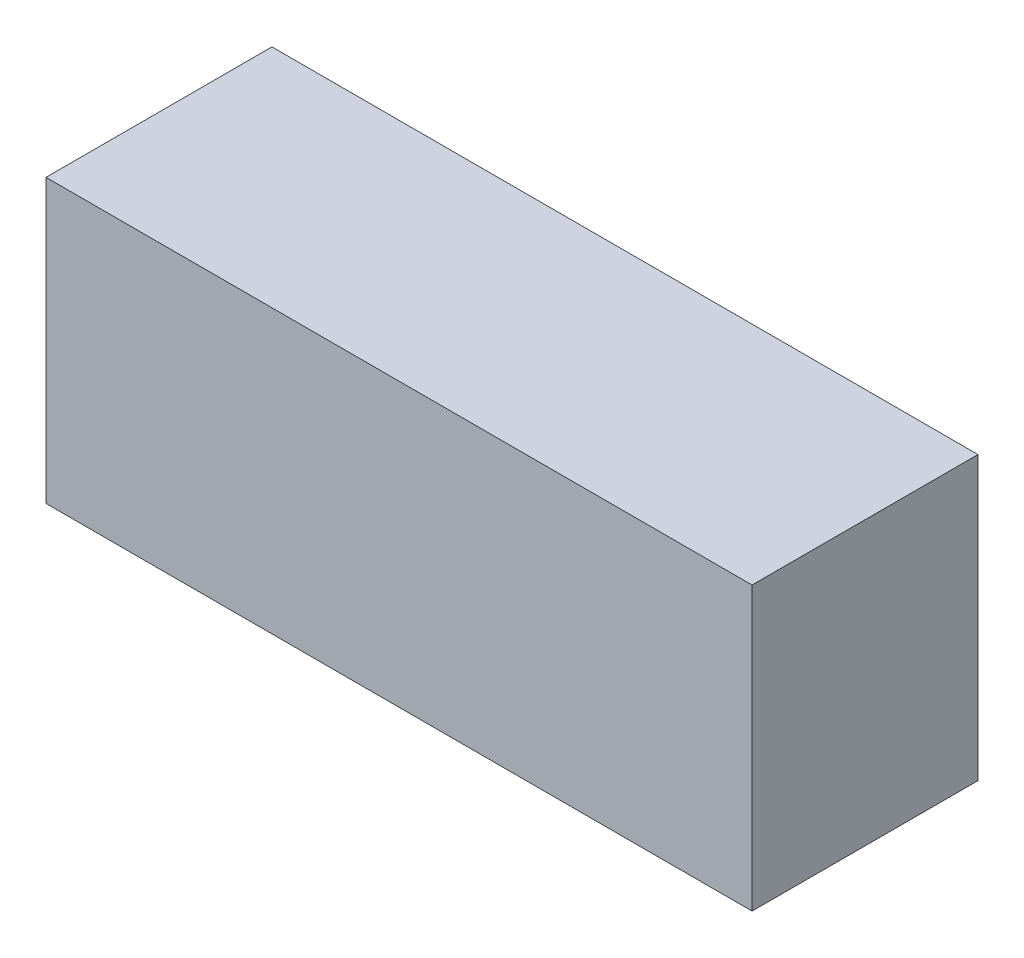
ISO-10303-21;
HEADER;
FILE_DESCRIPTION(('STEP AP214'),'2;1');
FILE_NAME('part.step','',(''),(''),'','','');
FILE_SCHEMA(('AUTOMOTIVE_DESIGN { 1 0 10303 214 1 1 1 1 }'));
ENDSEC;
DATA;
#1=APPLICATION_CONTEXT('core data for automotive mechanical design processes');
#2=APPLICATION_PROTOCOL_DEFINITION('international standard','automotive_design',2000,#1);
#3=PRODUCT_CONTEXT('',#1,'mechanical');
#4=PRODUCT('Part','Part','',(#3));
#5=PRODUCT_RELATED_PRODUCT_CATEGORY('part','',(#4));
#6=PRODUCT_DEFINITION_FORMATION('','',#4);
#7=PRODUCT_DEFINITION_CONTEXT('part definition',#1,'design');
#8=PRODUCT_DEFINITION('design','',#6,#7);
#9=PRODUCT_DEFINITION_SHAPE('','',#8);
#10=(LENGTH_UNIT() NAMED_UNIT(*) SI_UNIT(.MILLI.,.METRE.));
#11=(NAMED_UNIT(*) PLANE_ANGLE_UNIT() SI_UNIT($,.RADIAN.));
#12=(NAMED_UNIT(*) SI_UNIT($,.STERADIAN.) SOLID_ANGLE_UNIT());
#13=UNCERTAINTY_MEASURE_WITH_UNIT(LENGTH_MEASURE(1.E-05),#10,'distance_accuracy_value','');
#14=(GEOMETRIC_REPRESENTATION_CONTEXT(3) GLOBAL_UNCERTAINTY_ASSIGNED_CONTEXT((#13)) GLOBAL_UNIT_ASSIGNED_CONTEXT((#10,
#11,#12)) REPRESENTATION_CONTEXT('',''));
#15=CARTESIAN_POINT('',(0.,0.,0.));
#16=DIRECTION('',(0.,0.,1.));
#17=DIRECTION('',(1.,0.,0.));
#18=AXIS2_PLACEMENT_3D('',#15,#16,#17);
#19=CARTESIAN_POINT('',(0.,250.,0.));
#20=DIRECTION('',(1.,0.,0.));
#21=DIRECTION('',(0.,0.,-1.));
#22=AXIS2_PLACEMENT_3D('',#19,#20,#21);
#23=PLANE('',#22);
#24=DIRECTION('',(0.,0.,1.));
#25=VECTOR('',#24,1.);
#26=CARTESIAN_POINT('',(0.,0.,0.));
#27=LINE('',#26,#25);
#28=CARTESIAN_POINT('',(0.,0.,-200.));
#29=VERTEX_POINT('',#28);
#30=CARTESIAN_POINT('',(0.,0.,0.));
#31=VERTEX_POINT('',#30);
#32=EDGE_CURVE('E113',#29,#31,#27,.T.);
#33=ORIENTED_EDGE('',*,*,#32,.T.);
#34=DIRECTION('',(0.,-1.,0.));
#35=VECTOR('',#34,1.);
#36=CARTESIAN_POINT('',(0.,250.,0.));
#37=LINE('',#36,#35);
#38=CARTESIAN_POINT('',(0.,250.,0.));
#39=VERTEX_POINT('',#38);
#40=EDGE_CURVE('E11',#39,#31,#37,.T.);
#41=ORIENTED_EDGE('',*,*,#40,.F.);
#42=DIRECTION('',(0.,0.,1.));
#43=VECTOR('',#42,1.);
#44=CARTESIAN_POINT('',(0.,250.,0.));
#45=LINE('',#44,#43);
#46=CARTESIAN_POINT('',(0.,250.,-200.));
#47=VERTEX_POINT('',#46);
#48=EDGE_CURVE('E97',#47,#39,#45,.T.);
#49=ORIENTED_EDGE('',*,*,#48,.F.);
#50=DIRECTION('',(0.,-1.,0.));
#51=VECTOR('',#50,1.);
#52=CARTESIAN_POINT('',(0.,250.,-200.));
#53=LINE('',#52,#51);
#54=EDGE_CURVE('E109',#47,#29,#53,.T.);
#55=ORIENTED_EDGE('',*,*,#54,.T.);
#56=EDGE_LOOP('',(#33,#41,#49,#55));
#57=FACE_BOUND('',#56,.T.);
#58=ADVANCED_FACE('F45',(#57),#23,.F.);
#59=CARTESIAN_POINT('',(0.,250.,0.));
#60=DIRECTION('',(0.,0.,-1.));
#61=DIRECTION('',(-1.,0.,0.));
#62=AXIS2_PLACEMENT_3D('',#59,#60,#61);
#63=PLANE('',#62);
#64=DIRECTION('',(1.,0.,0.));
#65=VECTOR('',#64,1.);
#66=CARTESIAN_POINT('',(0.,0.,0.));
#67=LINE('',#66,#65);
#68=CARTESIAN_POINT('',(625.,0.,0.));
#69=VERTEX_POINT('',#68);
#70=EDGE_CURVE('E102',#31,#69,#67,.T.);
#71=ORIENTED_EDGE('',*,*,#70,.T.);
#72=DIRECTION('',(0.,-1.,0.));
#73=VECTOR('',#72,1.);
#74=CARTESIAN_POINT('',(625.,250.,0.));
#75=LINE('',#74,#73);
#76=CARTESIAN_POINT('',(625.,250.,0.));
#77=VERTEX_POINT('',#76);
#78=EDGE_CURVE('E54',#77,#69,#75,.T.);
#79=ORIENTED_EDGE('',*,*,#78,.F.);
#80=DIRECTION('',(1.,0.,0.));
#81=VECTOR('',#80,1.);
#82=CARTESIAN_POINT('',(0.,250.,0.));
#83=LINE('',#82,#81);
#84=EDGE_CURVE('E92',#39,#77,#83,.T.);
#85=ORIENTED_EDGE('',*,*,#84,.F.);
#86=ORIENTED_EDGE('',*,*,#40,.T.);
#87=EDGE_LOOP('',(#71,#79,#85,#86));
#88=FACE_BOUND('',#87,.T.);
#89=ADVANCED_FACE('F101',(#88),#63,.F.);
#90=CARTESIAN_POINT('',(625.,250.,0.));
#91=DIRECTION('',(-1.,0.,0.));
#92=DIRECTION('',(0.,0.,1.));
#93=AXIS2_PLACEMENT_3D('',#90,#91,#92);
#94=PLANE('',#93);
#95=DIRECTION('',(0.,0.,-1.));
#96=VECTOR('',#95,1.);
#97=CARTESIAN_POINT('',(625.,0.,0.));
#98=LINE('',#97,#96);
#99=CARTESIAN_POINT('',(625.,0.,-200.));
#100=VERTEX_POINT('',#99);
#101=EDGE_CURVE('E79',#69,#100,#98,.T.);
#102=ORIENTED_EDGE('',*,*,#101,.T.);
#103=DIRECTION('',(0.,-1.,0.));
#104=VECTOR('',#103,1.);
#105=CARTESIAN_POINT('',(625.,250.,-200.));
#106=LINE('',#105,#104);
#107=CARTESIAN_POINT('',(625.,250.,-200.));
#108=VERTEX_POINT('',#107);
#109=EDGE_CURVE('E104',#108,#100,#106,.T.);
#110=ORIENTED_EDGE('',*,*,#109,.F.);
#111=DIRECTION('',(0.,0.,-1.));
#112=VECTOR('',#111,1.);
#113=CARTESIAN_POINT('',(625.,250.,0.));
#114=LINE('',#113,#112);
#115=EDGE_CURVE('E95',#77,#108,#114,.T.);
#116=ORIENTED_EDGE('',*,*,#115,.F.);
#117=ORIENTED_EDGE('',*,*,#78,.T.);
#118=EDGE_LOOP('',(#102,#110,#116,#117));
#119=FACE_BOUND('',#118,.T.);
#120=ADVANCED_FACE('F105',(#119),#94,.F.);
#121=CARTESIAN_POINT('',(0.,250.,-200.));
#122=DIRECTION('',(0.,0.,1.));
#123=DIRECTION('',(1.,0.,0.));
#124=AXIS2_PLACEMENT_3D('',#121,#122,#123);
#125=PLANE('',#124);
#126=DIRECTION('',(-1.,0.,0.));
#127=VECTOR('',#126,1.);
#128=CARTESIAN_POINT('',(0.,0.,-200.));
#129=LINE('',#128,#127);
#130=EDGE_CURVE('E85',#100,#29,#129,.T.);
#131=ORIENTED_EDGE('',*,*,#130,.T.);
#132=ORIENTED_EDGE('',*,*,#54,.F.);
#133=DIRECTION('',(-1.,0.,0.));
#134=VECTOR('',#133,1.);
#135=CARTESIAN_POINT('',(0.,250.,-200.));
#136=LINE('',#135,#134);
#137=EDGE_CURVE('E62',#108,#47,#136,.T.);
#138=ORIENTED_EDGE('',*,*,#137,.F.);
#139=ORIENTED_EDGE('',*,*,#109,.T.);
#140=EDGE_LOOP('',(#131,#132,#138,#139));
#141=FACE_BOUND('',#140,.T.);
#142=ADVANCED_FACE('F126',(#141),#125,.F.);
#143=CARTESIAN_POINT('',(0.,250.,0.));
#144=DIRECTION('',(0.,-1.,0.));
#145=DIRECTION('',(0.,0.,-1.));
#146=AXIS2_PLACEMENT_3D('',#143,#144,#145);
#147=PLANE('',#146);
#148=ORIENTED_EDGE('',*,*,#48,.T.);
#149=ORIENTED_EDGE('',*,*,#84,.T.);
#150=ORIENTED_EDGE('',*,*,#115,.T.);
#151=ORIENTED_EDGE('',*,*,#137,.T.);
#152=EDGE_LOOP('',(#148,#149,#150,#151));
#153=FACE_BOUND('',#152,.T.);
#154=ADVANCED_FACE('F93',(#153),#147,.F.);
#155=CARTESIAN_POINT('',(0.,0.,0.));
#156=DIRECTION('',(0.,-1.,0.));
#157=DIRECTION('',(0.,0.,-1.));
#158=AXIS2_PLACEMENT_3D('',#155,#156,#157);
#159=PLANE('',#158);
#160=ORIENTED_EDGE('',*,*,#32,.F.);
#161=ORIENTED_EDGE('',*,*,#130,.F.);
#162=ORIENTED_EDGE('',*,*,#101,.F.);
#163=ORIENTED_EDGE('',*,*,#70,.F.);
#164=EDGE_LOOP('',(#160,#161,#162,#163));
#165=FACE_BOUND('',#164,.T.);
#166=ADVANCED_FACE('F129',(#165),#159,.T.);
#167=CLOSED_SHELL('',(#58,#89,#120,#142,#154,#166));
#168=MANIFOLD_SOLID_BREP('B2',#167);
#169=ADVANCED_BREP_SHAPE_REPRESENTATION('',(#18,#168),#14);
#170=SHAPE_DEFINITION_REPRESENTATION(#9,#169);
ENDSEC;
END-ISO-10303-21;
